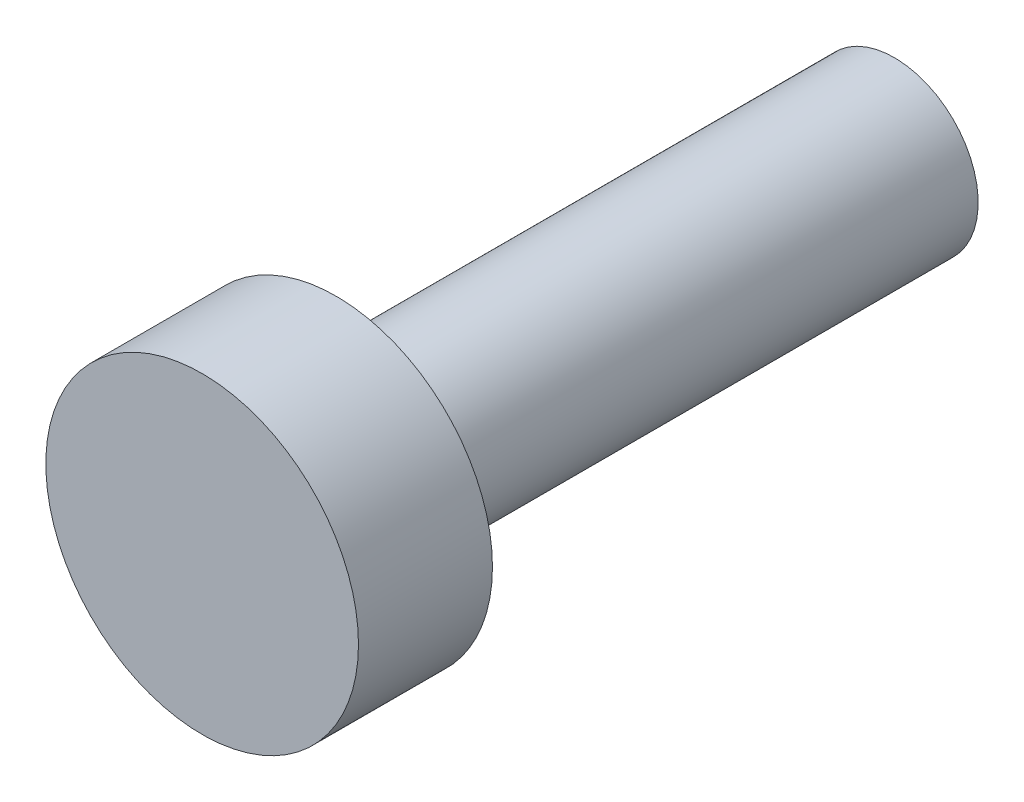
ISO-10303-21;
HEADER;
FILE_DESCRIPTION(('STEP AP214'),'2;1');
FILE_NAME('part.step','',(''),(''),'','','');
FILE_SCHEMA(('AUTOMOTIVE_DESIGN { 1 0 10303 214 1 1 1 1 }'));
ENDSEC;
DATA;
#1=APPLICATION_CONTEXT('core data for automotive mechanical design processes');
#2=APPLICATION_PROTOCOL_DEFINITION('international standard','automotive_design',2000,#1);
#3=PRODUCT_CONTEXT('',#1,'mechanical');
#4=PRODUCT('Part','Part','',(#3));
#5=PRODUCT_RELATED_PRODUCT_CATEGORY('part','',(#4));
#6=PRODUCT_DEFINITION_FORMATION('','',#4);
#7=PRODUCT_DEFINITION_CONTEXT('part definition',#1,'design');
#8=PRODUCT_DEFINITION('design','',#6,#7);
#9=PRODUCT_DEFINITION_SHAPE('','',#8);
#10=(LENGTH_UNIT() NAMED_UNIT(*) SI_UNIT(.MILLI.,.METRE.));
#11=(NAMED_UNIT(*) PLANE_ANGLE_UNIT() SI_UNIT($,.RADIAN.));
#12=(NAMED_UNIT(*) SI_UNIT($,.STERADIAN.) SOLID_ANGLE_UNIT());
#13=UNCERTAINTY_MEASURE_WITH_UNIT(LENGTH_MEASURE(1.E-05),#10,'distance_accuracy_value','');
#14=(GEOMETRIC_REPRESENTATION_CONTEXT(3) GLOBAL_UNCERTAINTY_ASSIGNED_CONTEXT((#13)) GLOBAL_UNIT_ASSIGNED_CONTEXT((#10,
#11,#12)) REPRESENTATION_CONTEXT('',''));
#15=CARTESIAN_POINT('',(0.,0.,0.));
#16=DIRECTION('',(0.,0.,1.));
#17=DIRECTION('',(1.,0.,0.));
#18=AXIS2_PLACEMENT_3D('',#15,#16,#17);
#19=CARTESIAN_POINT('',(0.,0.,2.4));
#20=DIRECTION('',(0.,0.,-1.));
#21=DIRECTION('',(-1.,0.,0.));
#22=AXIS2_PLACEMENT_3D('',#19,#20,#21);
#23=CYLINDRICAL_SURFACE('',#22,2.8);
#24=CARTESIAN_POINT('',(0.,0.,2.4));
#25=DIRECTION('',(0.,0.,1.));
#26=DIRECTION('',(1.,0.,0.));
#27=AXIS2_PLACEMENT_3D('',#24,#25,#26);
#28=CIRCLE('',#27,2.8);
#29=CARTESIAN_POINT('',(2.8,0.,2.4));
#30=VERTEX_POINT('',#29);
#31=EDGE_CURVE('E38',#30,#30,#28,.T.);
#32=ORIENTED_EDGE('',*,*,#31,.F.);
#33=EDGE_LOOP('',(#32));
#34=FACE_BOUND('',#33,.T.);
#35=CARTESIAN_POINT('',(0.,0.,0.));
#36=DIRECTION('',(0.,0.,1.));
#37=DIRECTION('',(1.,0.,0.));
#38=AXIS2_PLACEMENT_3D('',#35,#36,#37);
#39=CIRCLE('',#38,2.8);
#40=CARTESIAN_POINT('',(2.8,0.,0.));
#41=VERTEX_POINT('',#40);
#42=EDGE_CURVE('E34',#41,#41,#39,.T.);
#43=ORIENTED_EDGE('',*,*,#42,.T.);
#44=EDGE_LOOP('',(#43));
#45=FACE_BOUND('',#44,.T.);
#46=ADVANCED_FACE('F31',(#34,#45),#23,.T.);
#47=CARTESIAN_POINT('',(0.,0.,2.4));
#48=DIRECTION('',(0.,0.,1.));
#49=DIRECTION('',(1.,0.,0.));
#50=AXIS2_PLACEMENT_3D('',#47,#48,#49);
#51=PLANE('',#50);
#52=ORIENTED_EDGE('',*,*,#31,.T.);
#53=EDGE_LOOP('',(#52));
#54=FACE_BOUND('',#53,.T.);
#55=ADVANCED_FACE('F55',(#54),#51,.T.);
#56=CARTESIAN_POINT('',(0.,0.,0.));
#57=DIRECTION('',(0.,0.,1.));
#58=DIRECTION('',(1.,0.,0.));
#59=AXIS2_PLACEMENT_3D('',#56,#57,#58);
#60=PLANE('',#59);
#61=CARTESIAN_POINT('',(0.,0.,0.));
#62=DIRECTION('',(0.,0.,-1.));
#63=DIRECTION('',(-1.,0.,0.));
#64=AXIS2_PLACEMENT_3D('',#61,#62,#63);
#65=CIRCLE('',#64,1.5);
#66=CARTESIAN_POINT('',(-1.5,0.,0.));
#67=VERTEX_POINT('',#66);
#68=EDGE_CURVE('E10',#67,#67,#65,.T.);
#69=ORIENTED_EDGE('',*,*,#68,.F.);
#70=EDGE_LOOP('',(#69));
#71=FACE_BOUND('',#70,.T.);
#72=ORIENTED_EDGE('',*,*,#42,.F.);
#73=EDGE_LOOP('',(#72));
#74=FACE_BOUND('',#73,.T.);
#75=ADVANCED_FACE('F52',(#71,#74),#60,.F.);
#76=CARTESIAN_POINT('',(0.,0.,-10.));
#77=DIRECTION('',(0.,0.,1.));
#78=DIRECTION('',(1.,0.,0.));
#79=AXIS2_PLACEMENT_3D('',#76,#77,#78);
#80=CYLINDRICAL_SURFACE('',#79,1.5);
#81=CARTESIAN_POINT('',(0.,0.,-10.));
#82=DIRECTION('',(0.,0.,-1.));
#83=DIRECTION('',(-1.,0.,0.));
#84=AXIS2_PLACEMENT_3D('',#81,#82,#83);
#85=CIRCLE('',#84,1.5);
#86=CARTESIAN_POINT('',(-1.5,0.,-10.));
#87=VERTEX_POINT('',#86);
#88=EDGE_CURVE('E44',#87,#87,#85,.T.);
#89=ORIENTED_EDGE('',*,*,#88,.F.);
#90=EDGE_LOOP('',(#89));
#91=FACE_BOUND('',#90,.T.);
#92=ORIENTED_EDGE('',*,*,#68,.T.);
#93=EDGE_LOOP('',(#92));
#94=FACE_BOUND('',#93,.T.);
#95=ADVANCED_FACE('F54',(#91,#94),#80,.T.);
#96=CARTESIAN_POINT('',(0.,0.,-10.));
#97=DIRECTION('',(0.,0.,-1.));
#98=DIRECTION('',(-1.,0.,0.));
#99=AXIS2_PLACEMENT_3D('',#96,#97,#98);
#100=PLANE('',#99);
#101=ORIENTED_EDGE('',*,*,#88,.T.);
#102=EDGE_LOOP('',(#101));
#103=FACE_BOUND('',#102,.T.);
#104=ADVANCED_FACE('F61',(#103),#100,.T.);
#105=CLOSED_SHELL('',(#46,#55,#75,#95,#104));
#106=MANIFOLD_SOLID_BREP('B2',#105);
#107=ADVANCED_BREP_SHAPE_REPRESENTATION('',(#18,#106),#14);
#108=SHAPE_DEFINITION_REPRESENTATION(#9,#107);
ENDSEC;
END-ISO-10303-21;
